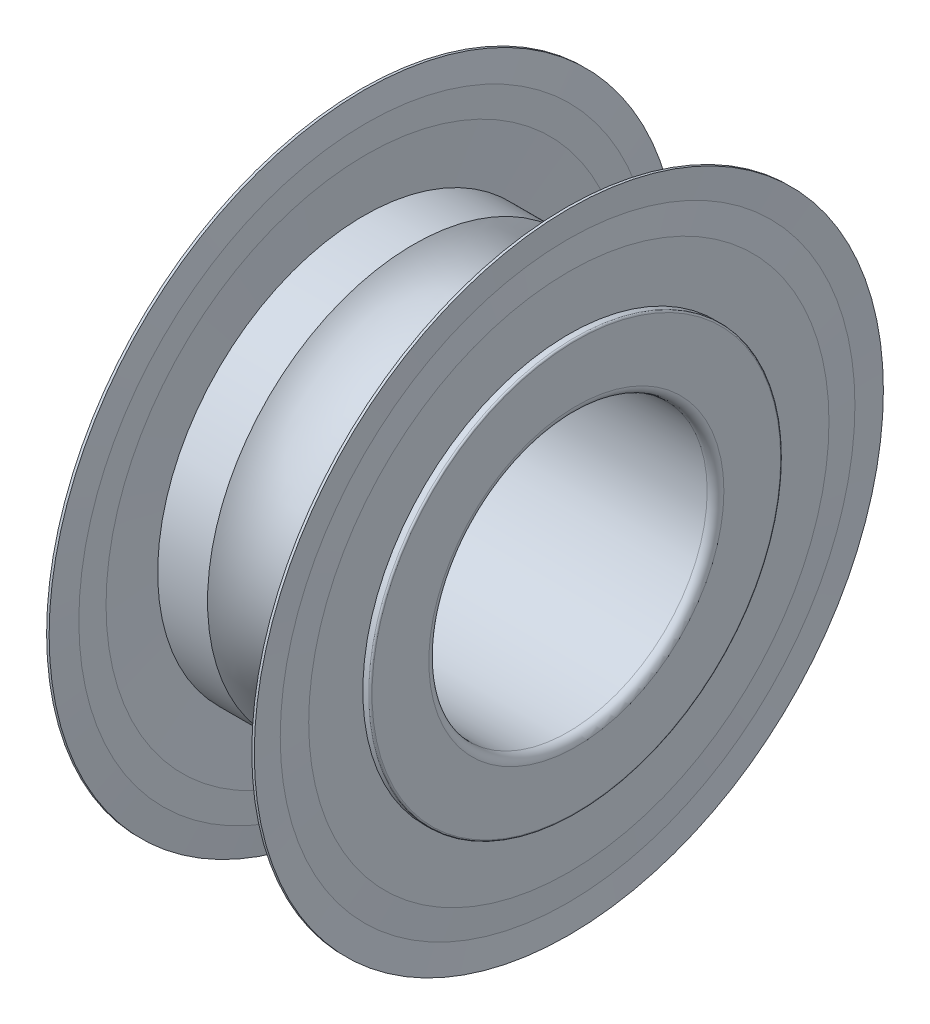
ISO-10303-21;
HEADER;
FILE_DESCRIPTION(('STEP AP214'),'2;1');
FILE_NAME('part.step','',(''),(''),'','','');
FILE_SCHEMA(('AUTOMOTIVE_DESIGN { 1 0 10303 214 1 1 1 1 }'));
ENDSEC;
DATA;
#1=APPLICATION_CONTEXT('core data for automotive mechanical design processes');
#2=APPLICATION_PROTOCOL_DEFINITION('international standard','automotive_design',2000,#1);
#3=PRODUCT_CONTEXT('',#1,'mechanical');
#4=PRODUCT('Part','Part','',(#3));
#5=PRODUCT_RELATED_PRODUCT_CATEGORY('part','',(#4));
#6=PRODUCT_DEFINITION_FORMATION('','',#4);
#7=PRODUCT_DEFINITION_CONTEXT('part definition',#1,'design');
#8=PRODUCT_DEFINITION('design','',#6,#7);
#9=PRODUCT_DEFINITION_SHAPE('','',#8);
#10=(LENGTH_UNIT() NAMED_UNIT(*) SI_UNIT(.MILLI.,.METRE.));
#11=(NAMED_UNIT(*) PLANE_ANGLE_UNIT() SI_UNIT($,.RADIAN.));
#12=(NAMED_UNIT(*) SI_UNIT($,.STERADIAN.) SOLID_ANGLE_UNIT());
#13=UNCERTAINTY_MEASURE_WITH_UNIT(LENGTH_MEASURE(1.E-05),#10,'distance_accuracy_value','');
#14=(GEOMETRIC_REPRESENTATION_CONTEXT(3) GLOBAL_UNCERTAINTY_ASSIGNED_CONTEXT((#13)) GLOBAL_UNIT_ASSIGNED_CONTEXT((#10,
#11,#12)) REPRESENTATION_CONTEXT('',''));
#15=CARTESIAN_POINT('',(0.,0.,0.));
#16=DIRECTION('',(0.,0.,1.));
#17=DIRECTION('',(1.,0.,0.));
#18=AXIS2_PLACEMENT_3D('',#15,#16,#17);
#19=CARTESIAN_POINT('',(50.,0.,0.));
#20=DIRECTION('',(1.,0.,0.));
#21=DIRECTION('',(0.,0.,-1.));
#22=AXIS2_PLACEMENT_3D('',#19,#20,#21);
#23=CYLINDRICAL_SURFACE('',#22,7.4);
#24=CARTESIAN_POINT('',(5.84909734735627,0.,0.));
#25=DIRECTION('',(1.,0.,0.));
#26=DIRECTION('',(0.,0.,-1.));
#27=AXIS2_PLACEMENT_3D('',#24,#25,#26);
#28=CIRCLE('',#27,7.4);
#29=CARTESIAN_POINT('',(5.84909734735627,0.,-7.4));
#30=VERTEX_POINT('',#29);
#31=EDGE_CURVE('E55',#30,#30,#28,.T.);
#32=ORIENTED_EDGE('',*,*,#31,.T.);
#33=EDGE_LOOP('',(#32));
#34=FACE_BOUND('',#33,.T.);
#35=CARTESIAN_POINT('',(7.63953964194374,0.,0.));
#36=DIRECTION('',(-1.,0.,0.));
#37=DIRECTION('',(0.,0.,1.));
#38=AXIS2_PLACEMENT_3D('',#35,#36,#37);
#39=CIRCLE('',#38,7.4);
#40=CARTESIAN_POINT('',(7.63953964194374,0.,7.4));
#41=VERTEX_POINT('',#40);
#42=EDGE_CURVE('E10',#41,#41,#39,.F.);
#43=ORIENTED_EDGE('',*,*,#42,.F.);
#44=EDGE_LOOP('',(#43));
#45=FACE_BOUND('',#44,.T.);
#46=ADVANCED_FACE('F14',(#34,#45),#23,.T.);
#47=CARTESIAN_POINT('',(50.,0.,0.));
#48=DIRECTION('',(1.,0.,0.));
#49=DIRECTION('',(0.,0.,-1.));
#50=AXIS2_PLACEMENT_3D('',#47,#48,#49);
#51=CYLINDRICAL_SURFACE('',#50,7.4);
#52=CARTESIAN_POINT('',(0.0599999999999976,0.,0.));
#53=DIRECTION('',(1.,0.,0.));
#54=DIRECTION('',(0.,0.,-1.));
#55=AXIS2_PLACEMENT_3D('',#52,#53,#54);
#56=CIRCLE('',#55,7.4);
#57=CARTESIAN_POINT('',(0.0599999999999976,0.,-7.4));
#58=VERTEX_POINT('',#57);
#59=EDGE_CURVE('E61',#58,#58,#56,.T.);
#60=ORIENTED_EDGE('',*,*,#59,.T.);
#61=EDGE_LOOP('',(#60));
#62=FACE_BOUND('',#61,.T.);
#63=CARTESIAN_POINT('',(0.27,0.,0.));
#64=DIRECTION('',(-1.,0.,0.));
#65=DIRECTION('',(0.,0.,1.));
#66=AXIS2_PLACEMENT_3D('',#63,#64,#65);
#67=CIRCLE('',#66,7.4);
#68=CARTESIAN_POINT('',(0.27,0.,7.4));
#69=VERTEX_POINT('',#68);
#70=EDGE_CURVE('E25',#69,#69,#67,.F.);
#71=ORIENTED_EDGE('',*,*,#70,.F.);
#72=EDGE_LOOP('',(#71));
#73=FACE_BOUND('',#72,.T.);
#74=ADVANCED_FACE('F122',(#62,#73),#51,.T.);
#75=CARTESIAN_POINT('',(0.0599999999999989,0.,0.));
#76=DIRECTION('',(1.,0.,0.));
#77=DIRECTION('',(0.,0.,-1.));
#78=AXIS2_PLACEMENT_3D('',#75,#76,#77);
#79=TOROIDAL_SURFACE('',#78,7.34,0.0599999999999984);
#80=CARTESIAN_POINT('',(0.,0.,0.));
#81=DIRECTION('',(1.,0.,0.));
#82=DIRECTION('',(0.,0.,-1.));
#83=AXIS2_PLACEMENT_3D('',#80,#81,#82);
#84=CIRCLE('',#83,7.34);
#85=CARTESIAN_POINT('',(0.,0.,-7.34));
#86=VERTEX_POINT('',#85);
#87=EDGE_CURVE('E34',#86,#86,#84,.T.);
#88=ORIENTED_EDGE('',*,*,#87,.T.);
#89=EDGE_LOOP('',(#88));
#90=FACE_BOUND('',#89,.T.);
#91=ORIENTED_EDGE('',*,*,#59,.F.);
#92=EDGE_LOOP('',(#91));
#93=FACE_BOUND('',#92,.T.);
#94=ADVANCED_FACE('F16',(#90,#93),#79,.T.);
#95=CARTESIAN_POINT('',(0.,7.34,0.));
#96=DIRECTION('',(-1.,0.,0.));
#97=DIRECTION('',(0.,0.,1.));
#98=AXIS2_PLACEMENT_3D('',#95,#96,#97);
#99=PLANE('',#98);
#100=CARTESIAN_POINT('',(0.,0.,0.));
#101=DIRECTION('',(1.,0.,0.));
#102=DIRECTION('',(0.,0.,-1.));
#103=AXIS2_PLACEMENT_3D('',#100,#101,#102);
#104=CIRCLE('',#103,5.3);
#105=CARTESIAN_POINT('',(0.,0.,-5.3));
#106=VERTEX_POINT('',#105);
#107=EDGE_CURVE('E37',#106,#106,#104,.T.);
#108=ORIENTED_EDGE('',*,*,#107,.T.);
#109=EDGE_LOOP('',(#108));
#110=FACE_BOUND('',#109,.T.);
#111=ORIENTED_EDGE('',*,*,#87,.F.);
#112=EDGE_LOOP('',(#111));
#113=FACE_BOUND('',#112,.T.);
#114=ADVANCED_FACE('F171',(#110,#113),#99,.T.);
#115=CARTESIAN_POINT('',(0.3,0.,0.));
#116=DIRECTION('',(1.,0.,0.));
#117=DIRECTION('',(0.,0.,-1.));
#118=AXIS2_PLACEMENT_3D('',#115,#116,#117);
#119=TOROIDAL_SURFACE('',#118,5.3,0.3);
#120=CARTESIAN_POINT('',(0.3,0.,0.));
#121=DIRECTION('',(1.,0.,0.));
#122=DIRECTION('',(0.,0.,-1.));
#123=AXIS2_PLACEMENT_3D('',#120,#121,#122);
#124=CIRCLE('',#123,5.);
#125=CARTESIAN_POINT('',(0.3,0.,-5.));
#126=VERTEX_POINT('',#125);
#127=EDGE_CURVE('E40',#126,#126,#124,.T.);
#128=ORIENTED_EDGE('',*,*,#127,.T.);
#129=EDGE_LOOP('',(#128));
#130=FACE_BOUND('',#129,.T.);
#131=ORIENTED_EDGE('',*,*,#107,.F.);
#132=EDGE_LOOP('',(#131));
#133=FACE_BOUND('',#132,.T.);
#134=ADVANCED_FACE('F165',(#130,#133),#119,.T.);
#135=CARTESIAN_POINT('',(50.,0.,0.));
#136=DIRECTION('',(1.,0.,0.));
#137=DIRECTION('',(0.,0.,-1.));
#138=AXIS2_PLACEMENT_3D('',#135,#136,#137);
#139=CYLINDRICAL_SURFACE('',#138,5.);
#140=CARTESIAN_POINT('',(7.7,0.,0.));
#141=DIRECTION('',(1.,0.,0.));
#142=DIRECTION('',(0.,0.,-1.));
#143=AXIS2_PLACEMENT_3D('',#140,#141,#142);
#144=CIRCLE('',#143,5.);
#145=CARTESIAN_POINT('',(7.7,0.,-5.));
#146=VERTEX_POINT('',#145);
#147=EDGE_CURVE('E43',#146,#146,#144,.T.);
#148=ORIENTED_EDGE('',*,*,#147,.T.);
#149=EDGE_LOOP('',(#148));
#150=FACE_BOUND('',#149,.T.);
#151=ORIENTED_EDGE('',*,*,#127,.F.);
#152=EDGE_LOOP('',(#151));
#153=FACE_BOUND('',#152,.T.);
#154=ADVANCED_FACE('F159',(#150,#153),#139,.F.);
#155=CARTESIAN_POINT('',(7.7,0.,0.));
#156=DIRECTION('',(1.,0.,0.));
#157=DIRECTION('',(0.,0.,-1.));
#158=AXIS2_PLACEMENT_3D('',#155,#156,#157);
#159=TOROIDAL_SURFACE('',#158,5.3,0.300000000000003);
#160=CARTESIAN_POINT('',(8.,0.,0.));
#161=DIRECTION('',(1.,0.,0.));
#162=DIRECTION('',(0.,0.,-1.));
#163=AXIS2_PLACEMENT_3D('',#160,#161,#162);
#164=CIRCLE('',#163,5.3);
#165=CARTESIAN_POINT('',(8.,0.,-5.3));
#166=VERTEX_POINT('',#165);
#167=EDGE_CURVE('E46',#166,#166,#164,.T.);
#168=ORIENTED_EDGE('',*,*,#167,.T.);
#169=EDGE_LOOP('',(#168));
#170=FACE_BOUND('',#169,.T.);
#171=ORIENTED_EDGE('',*,*,#147,.F.);
#172=EDGE_LOOP('',(#171));
#173=FACE_BOUND('',#172,.T.);
#174=ADVANCED_FACE('F153',(#170,#173),#159,.T.);
#175=CARTESIAN_POINT('',(8.,5.3,0.));
#176=DIRECTION('',(1.,0.,0.));
#177=DIRECTION('',(0.,0.,-1.));
#178=AXIS2_PLACEMENT_3D('',#175,#176,#177);
#179=PLANE('',#178);
#180=CARTESIAN_POINT('',(8.,0.,0.));
#181=DIRECTION('',(1.,0.,0.));
#182=DIRECTION('',(0.,0.,-1.));
#183=AXIS2_PLACEMENT_3D('',#180,#181,#182);
#184=CIRCLE('',#183,7.34);
#185=CARTESIAN_POINT('',(8.,0.,-7.34));
#186=VERTEX_POINT('',#185);
#187=EDGE_CURVE('E49',#186,#186,#184,.T.);
#188=ORIENTED_EDGE('',*,*,#187,.T.);
#189=EDGE_LOOP('',(#188));
#190=FACE_BOUND('',#189,.T.);
#191=ORIENTED_EDGE('',*,*,#167,.F.);
#192=EDGE_LOOP('',(#191));
#193=FACE_BOUND('',#192,.T.);
#194=ADVANCED_FACE('F144',(#190,#193),#179,.T.);
#195=CARTESIAN_POINT('',(7.94,0.,0.));
#196=DIRECTION('',(1.,0.,0.));
#197=DIRECTION('',(0.,0.,-1.));
#198=AXIS2_PLACEMENT_3D('',#195,#196,#197);
#199=TOROIDAL_SURFACE('',#198,7.34,0.0599999999999993);
#200=CARTESIAN_POINT('',(7.94,0.,0.));
#201=DIRECTION('',(1.,0.,0.));
#202=DIRECTION('',(0.,0.,-1.));
#203=AXIS2_PLACEMENT_3D('',#200,#201,#202);
#204=CIRCLE('',#203,7.4);
#205=CARTESIAN_POINT('',(7.94,0.,-7.4));
#206=VERTEX_POINT('',#205);
#207=EDGE_CURVE('E52',#206,#206,#204,.T.);
#208=ORIENTED_EDGE('',*,*,#207,.T.);
#209=EDGE_LOOP('',(#208));
#210=FACE_BOUND('',#209,.T.);
#211=ORIENTED_EDGE('',*,*,#187,.F.);
#212=EDGE_LOOP('',(#211));
#213=FACE_BOUND('',#212,.T.);
#214=ADVANCED_FACE('F137',(#210,#213),#199,.T.);
#215=CARTESIAN_POINT('',(7.73,0.,0.));
#216=DIRECTION('',(1.,0.,0.));
#217=DIRECTION('',(0.,0.,-1.));
#218=AXIS2_PLACEMENT_3D('',#215,#216,#217);
#219=CIRCLE('',#218,7.4);
#220=CARTESIAN_POINT('',(7.73,0.,-7.4));
#221=VERTEX_POINT('',#220);
#222=EDGE_CURVE('E21',#221,#221,#219,.F.);
#223=ORIENTED_EDGE('',*,*,#222,.F.);
#224=EDGE_LOOP('',(#223));
#225=FACE_BOUND('',#224,.T.);
#226=ORIENTED_EDGE('',*,*,#207,.F.);
#227=EDGE_LOOP('',(#226));
#228=FACE_BOUND('',#227,.T.);
#229=ADVANCED_FACE('F125',(#225,#228),#23,.T.);
#230=CARTESIAN_POINT('',(4.,0.,0.));
#231=DIRECTION('',(1.,0.,0.));
#232=DIRECTION('',(0.,0.,-1.));
#233=AXIS2_PLACEMENT_3D('',#230,#231,#232);
#234=TOROIDAL_SURFACE('',#233,8.9,2.381);
#235=ORIENTED_EDGE('',*,*,#31,.F.);
#236=EDGE_LOOP('',(#235));
#237=FACE_BOUND('',#236,.T.);
#238=CARTESIAN_POINT('',(2.15090265264373,0.,0.));
#239=DIRECTION('',(1.,0.,0.));
#240=DIRECTION('',(0.,0.,-1.));
#241=AXIS2_PLACEMENT_3D('',#238,#239,#240);
#242=CIRCLE('',#241,7.4);
#243=CARTESIAN_POINT('',(2.15090265264373,0.,-7.4));
#244=VERTEX_POINT('',#243);
#245=EDGE_CURVE('E58',#244,#244,#242,.T.);
#246=ORIENTED_EDGE('',*,*,#245,.T.);
#247=EDGE_LOOP('',(#246));
#248=FACE_BOUND('',#247,.T.);
#249=ADVANCED_FACE('F136',(#237,#248),#234,.F.);
#250=CARTESIAN_POINT('',(0.360460358056265,0.,0.));
#251=DIRECTION('',(1.,0.,0.));
#252=DIRECTION('',(0.,0.,-1.));
#253=AXIS2_PLACEMENT_3D('',#250,#251,#252);
#254=CIRCLE('',#253,7.4);
#255=CARTESIAN_POINT('',(0.360460358056265,0.,-7.4));
#256=VERTEX_POINT('',#255);
#257=EDGE_CURVE('E29',#256,#256,#254,.F.);
#258=ORIENTED_EDGE('',*,*,#257,.F.);
#259=EDGE_LOOP('',(#258));
#260=FACE_BOUND('',#259,.T.);
#261=ORIENTED_EDGE('',*,*,#245,.F.);
#262=EDGE_LOOP('',(#261));
#263=FACE_BOUND('',#262,.T.);
#264=ADVANCED_FACE('F131',(#260,#263),#51,.T.);
#265=CARTESIAN_POINT('',(50.,0.,0.));
#266=DIRECTION('',(1.,0.,0.));
#267=DIRECTION('',(0.,0.,-1.));
#268=AXIS2_PLACEMENT_3D('',#265,#266,#267);
#269=CYLINDRICAL_SURFACE('',#268,11.3);
#270=CARTESIAN_POINT('',(0.27,0.,0.));
#271=DIRECTION('',(1.,0.,0.));
#272=DIRECTION('',(0.,0.,-1.));
#273=AXIS2_PLACEMENT_3D('',#270,#271,#272);
#274=CIRCLE('',#273,11.3);
#275=CARTESIAN_POINT('',(0.27,0.,-11.3));
#276=VERTEX_POINT('',#275);
#277=EDGE_CURVE('E64',#276,#276,#274,.T.);
#278=ORIENTED_EDGE('',*,*,#277,.T.);
#279=EDGE_LOOP('',(#278));
#280=FACE_BOUND('',#279,.T.);
#281=CARTESIAN_POINT('',(0.36,0.,0.));
#282=DIRECTION('',(1.,0.,0.));
#283=DIRECTION('',(0.,0.,-1.));
#284=AXIS2_PLACEMENT_3D('',#281,#282,#283);
#285=CIRCLE('',#284,11.3);
#286=CARTESIAN_POINT('',(0.36,0.,-11.3));
#287=VERTEX_POINT('',#286);
#288=EDGE_CURVE('E79',#287,#287,#285,.T.);
#289=ORIENTED_EDGE('',*,*,#288,.F.);
#290=EDGE_LOOP('',(#289));
#291=FACE_BOUND('',#290,.T.);
#292=ADVANCED_FACE('F201',(#280,#291),#269,.T.);
#293=CARTESIAN_POINT('',(0.27,0.,0.));
#294=DIRECTION('',(-1.,0.,0.));
#295=DIRECTION('',(0.,0.,1.));
#296=AXIS2_PLACEMENT_3D('',#293,#294,#295);
#297=CONICAL_SURFACE('',#296,11.3,1.52479300103466);
#298=CARTESIAN_POINT('',(0.315,0.,0.));
#299=DIRECTION('',(1.,0.,0.));
#300=DIRECTION('',(0.,0.,-1.));
#301=AXIS2_PLACEMENT_3D('',#298,#299,#300);
#302=CIRCLE('',#301,10.3225);
#303=CARTESIAN_POINT('',(0.315,0.,-10.3225));
#304=VERTEX_POINT('',#303);
#305=EDGE_CURVE('E67',#304,#304,#302,.T.);
#306=ORIENTED_EDGE('',*,*,#305,.T.);
#307=EDGE_LOOP('',(#306));
#308=FACE_BOUND('',#307,.T.);
#309=ORIENTED_EDGE('',*,*,#277,.F.);
#310=EDGE_LOOP('',(#309));
#311=FACE_BOUND('',#310,.T.);
#312=ADVANCED_FACE('F195',(#308,#311),#297,.F.);
#313=CARTESIAN_POINT('',(0.315,0.,0.));
#314=DIRECTION('',(1.,0.,0.));
#315=DIRECTION('',(0.,0.,-1.));
#316=AXIS2_PLACEMENT_3D('',#313,#314,#315);
#317=CONICAL_SURFACE('',#316,10.3225,1.52479300103466);
#318=CARTESIAN_POINT('',(0.27,0.,0.));
#319=DIRECTION('',(1.,0.,0.));
#320=DIRECTION('',(0.,0.,-1.));
#321=AXIS2_PLACEMENT_3D('',#318,#319,#320);
#322=CIRCLE('',#321,9.345);
#323=CARTESIAN_POINT('',(0.27,0.,-9.345));
#324=VERTEX_POINT('',#323);
#325=EDGE_CURVE('E70',#324,#324,#322,.T.);
#326=ORIENTED_EDGE('',*,*,#325,.T.);
#327=EDGE_LOOP('',(#326));
#328=FACE_BOUND('',#327,.T.);
#329=ORIENTED_EDGE('',*,*,#305,.F.);
#330=EDGE_LOOP('',(#329));
#331=FACE_BOUND('',#330,.T.);
#332=ADVANCED_FACE('F189',(#328,#331),#317,.T.);
#333=CARTESIAN_POINT('',(0.27,9.345,0.));
#334=DIRECTION('',(-1.,0.,0.));
#335=DIRECTION('',(0.,0.,1.));
#336=AXIS2_PLACEMENT_3D('',#333,#334,#335);
#337=PLANE('',#336);
#338=ORIENTED_EDGE('',*,*,#70,.T.);
#339=EDGE_LOOP('',(#338));
#340=FACE_BOUND('',#339,.T.);
#341=ORIENTED_EDGE('',*,*,#325,.F.);
#342=EDGE_LOOP('',(#341));
#343=FACE_BOUND('',#342,.T.);
#344=ADVANCED_FACE('F185',(#340,#343),#337,.T.);
#345=CARTESIAN_POINT('',(0.36,0.,0.));
#346=DIRECTION('',(1.,0.,0.));
#347=DIRECTION('',(0.,0.,-1.));
#348=AXIS2_PLACEMENT_3D('',#345,#346,#347);
#349=CONICAL_SURFACE('',#348,7.39,1.52479300103466);
#350=CARTESIAN_POINT('',(0.45,0.,0.));
#351=DIRECTION('',(1.,0.,0.));
#352=DIRECTION('',(0.,0.,-1.));
#353=AXIS2_PLACEMENT_3D('',#350,#351,#352);
#354=CIRCLE('',#353,9.345);
#355=CARTESIAN_POINT('',(0.45,0.,-9.345));
#356=VERTEX_POINT('',#355);
#357=EDGE_CURVE('E73',#356,#356,#354,.T.);
#358=ORIENTED_EDGE('',*,*,#357,.T.);
#359=EDGE_LOOP('',(#358));
#360=FACE_BOUND('',#359,.T.);
#361=ORIENTED_EDGE('',*,*,#257,.T.);
#362=EDGE_LOOP('',(#361));
#363=FACE_BOUND('',#362,.T.);
#364=ADVANCED_FACE('F188',(#360,#363),#349,.F.);
#365=CARTESIAN_POINT('',(0.45,9.345,0.));
#366=DIRECTION('',(1.,0.,0.));
#367=DIRECTION('',(0.,0.,-1.));
#368=AXIS2_PLACEMENT_3D('',#365,#366,#367);
#369=PLANE('',#368);
#370=CARTESIAN_POINT('',(0.45,0.,0.));
#371=DIRECTION('',(1.,0.,0.));
#372=DIRECTION('',(0.,0.,-1.));
#373=AXIS2_PLACEMENT_3D('',#370,#371,#372);
#374=CIRCLE('',#373,10.3225);
#375=CARTESIAN_POINT('',(0.45,0.,-10.3225));
#376=VERTEX_POINT('',#375);
#377=EDGE_CURVE('E76',#376,#376,#374,.T.);
#378=ORIENTED_EDGE('',*,*,#377,.T.);
#379=EDGE_LOOP('',(#378));
#380=FACE_BOUND('',#379,.T.);
#381=ORIENTED_EDGE('',*,*,#357,.F.);
#382=EDGE_LOOP('',(#381));
#383=FACE_BOUND('',#382,.T.);
#384=ADVANCED_FACE('F118',(#380,#383),#369,.T.);
#385=CARTESIAN_POINT('',(0.45,0.,0.));
#386=DIRECTION('',(-1.,0.,0.));
#387=DIRECTION('',(0.,0.,1.));
#388=AXIS2_PLACEMENT_3D('',#385,#386,#387);
#389=CONICAL_SURFACE('',#388,10.3225,1.478983569457);
#390=ORIENTED_EDGE('',*,*,#288,.T.);
#391=EDGE_LOOP('',(#390));
#392=FACE_BOUND('',#391,.T.);
#393=ORIENTED_EDGE('',*,*,#377,.F.);
#394=EDGE_LOOP('',(#393));
#395=FACE_BOUND('',#394,.T.);
#396=ADVANCED_FACE('F107',(#392,#395),#389,.T.);
#397=CARTESIAN_POINT('',(7.64,0.,0.));
#398=DIRECTION('',(1.,0.,0.));
#399=DIRECTION('',(0.,0.,-1.));
#400=AXIS2_PLACEMENT_3D('',#397,#398,#399);
#401=CONICAL_SURFACE('',#400,11.3,1.478983569457);
#402=CARTESIAN_POINT('',(7.55,0.,0.));
#403=DIRECTION('',(1.,0.,0.));
#404=DIRECTION('',(0.,0.,-1.));
#405=AXIS2_PLACEMENT_3D('',#402,#403,#404);
#406=CIRCLE('',#405,10.3225);
#407=CARTESIAN_POINT('',(7.55,0.,-10.3225));
#408=VERTEX_POINT('',#407);
#409=EDGE_CURVE('E82',#408,#408,#406,.T.);
#410=ORIENTED_EDGE('',*,*,#409,.T.);
#411=EDGE_LOOP('',(#410));
#412=FACE_BOUND('',#411,.T.);
#413=CARTESIAN_POINT('',(7.64,0.,0.));
#414=DIRECTION('',(1.,0.,0.));
#415=DIRECTION('',(0.,0.,-1.));
#416=AXIS2_PLACEMENT_3D('',#413,#414,#415);
#417=CIRCLE('',#416,11.3);
#418=CARTESIAN_POINT('',(7.64,0.,-11.3));
#419=VERTEX_POINT('',#418);
#420=EDGE_CURVE('E97',#419,#419,#417,.T.);
#421=ORIENTED_EDGE('',*,*,#420,.F.);
#422=EDGE_LOOP('',(#421));
#423=FACE_BOUND('',#422,.T.);
#424=ADVANCED_FACE('F104',(#412,#423),#401,.T.);
#425=CARTESIAN_POINT('',(7.55,10.3225,0.));
#426=DIRECTION('',(-1.,0.,0.));
#427=DIRECTION('',(0.,0.,1.));
#428=AXIS2_PLACEMENT_3D('',#425,#426,#427);
#429=PLANE('',#428);
#430=CARTESIAN_POINT('',(7.55,0.,0.));
#431=DIRECTION('',(1.,0.,0.));
#432=DIRECTION('',(0.,0.,-1.));
#433=AXIS2_PLACEMENT_3D('',#430,#431,#432);
#434=CIRCLE('',#433,9.345);
#435=CARTESIAN_POINT('',(7.55,0.,-9.345));
#436=VERTEX_POINT('',#435);
#437=EDGE_CURVE('E85',#436,#436,#434,.T.);
#438=ORIENTED_EDGE('',*,*,#437,.T.);
#439=EDGE_LOOP('',(#438));
#440=FACE_BOUND('',#439,.T.);
#441=ORIENTED_EDGE('',*,*,#409,.F.);
#442=EDGE_LOOP('',(#441));
#443=FACE_BOUND('',#442,.T.);
#444=ADVANCED_FACE('F106',(#440,#443),#429,.T.);
#445=CARTESIAN_POINT('',(7.55,0.,0.));
#446=DIRECTION('',(-1.,0.,0.));
#447=DIRECTION('',(0.,0.,1.));
#448=AXIS2_PLACEMENT_3D('',#445,#446,#447);
#449=CONICAL_SURFACE('',#448,9.345,1.52479300103466);
#450=ORIENTED_EDGE('',*,*,#42,.T.);
#451=EDGE_LOOP('',(#450));
#452=FACE_BOUND('',#451,.T.);
#453=ORIENTED_EDGE('',*,*,#437,.F.);
#454=EDGE_LOOP('',(#453));
#455=FACE_BOUND('',#454,.T.);
#456=ADVANCED_FACE('F115',(#452,#455),#449,.F.);
#457=CARTESIAN_POINT('',(7.73,7.39,0.));
#458=DIRECTION('',(1.,0.,0.));
#459=DIRECTION('',(0.,0.,-1.));
#460=AXIS2_PLACEMENT_3D('',#457,#458,#459);
#461=PLANE('',#460);
#462=CARTESIAN_POINT('',(7.73,0.,0.));
#463=DIRECTION('',(1.,0.,0.));
#464=DIRECTION('',(0.,0.,-1.));
#465=AXIS2_PLACEMENT_3D('',#462,#463,#464);
#466=CIRCLE('',#465,9.345);
#467=CARTESIAN_POINT('',(7.73,0.,-9.345));
#468=VERTEX_POINT('',#467);
#469=EDGE_CURVE('E88',#468,#468,#466,.T.);
#470=ORIENTED_EDGE('',*,*,#469,.T.);
#471=EDGE_LOOP('',(#470));
#472=FACE_BOUND('',#471,.T.);
#473=ORIENTED_EDGE('',*,*,#222,.T.);
#474=EDGE_LOOP('',(#473));
#475=FACE_BOUND('',#474,.T.);
#476=ADVANCED_FACE('F282',(#472,#475),#461,.T.);
#477=CARTESIAN_POINT('',(7.73,0.,0.));
#478=DIRECTION('',(-1.,0.,0.));
#479=DIRECTION('',(0.,0.,1.));
#480=AXIS2_PLACEMENT_3D('',#477,#478,#479);
#481=CONICAL_SURFACE('',#480,9.345,1.52479300103466);
#482=CARTESIAN_POINT('',(7.685,0.,0.));
#483=DIRECTION('',(1.,0.,0.));
#484=DIRECTION('',(0.,0.,-1.));
#485=AXIS2_PLACEMENT_3D('',#482,#483,#484);
#486=CIRCLE('',#485,10.3225);
#487=CARTESIAN_POINT('',(7.685,0.,-10.3225));
#488=VERTEX_POINT('',#487);
#489=EDGE_CURVE('E91',#488,#488,#486,.T.);
#490=ORIENTED_EDGE('',*,*,#489,.T.);
#491=EDGE_LOOP('',(#490));
#492=FACE_BOUND('',#491,.T.);
#493=ORIENTED_EDGE('',*,*,#469,.F.);
#494=EDGE_LOOP('',(#493));
#495=FACE_BOUND('',#494,.T.);
#496=ADVANCED_FACE('F291',(#492,#495),#481,.T.);
#497=CARTESIAN_POINT('',(7.685,0.,0.));
#498=DIRECTION('',(1.,0.,0.));
#499=DIRECTION('',(0.,0.,-1.));
#500=AXIS2_PLACEMENT_3D('',#497,#498,#499);
#501=CONICAL_SURFACE('',#500,10.3225,1.52479300103466);
#502=CARTESIAN_POINT('',(7.73,0.,0.));
#503=DIRECTION('',(1.,0.,0.));
#504=DIRECTION('',(0.,0.,-1.));
#505=AXIS2_PLACEMENT_3D('',#502,#503,#504);
#506=CIRCLE('',#505,11.3);
#507=CARTESIAN_POINT('',(7.73,0.,-11.3));
#508=VERTEX_POINT('',#507);
#509=EDGE_CURVE('E94',#508,#508,#506,.T.);
#510=ORIENTED_EDGE('',*,*,#509,.T.);
#511=EDGE_LOOP('',(#510));
#512=FACE_BOUND('',#511,.T.);
#513=ORIENTED_EDGE('',*,*,#489,.F.);
#514=EDGE_LOOP('',(#513));
#515=FACE_BOUND('',#514,.T.);
#516=ADVANCED_FACE('F301',(#512,#515),#501,.F.);
#517=CARTESIAN_POINT('',(50.,0.,0.));
#518=DIRECTION('',(1.,0.,0.));
#519=DIRECTION('',(0.,0.,-1.));
#520=AXIS2_PLACEMENT_3D('',#517,#518,#519);
#521=CYLINDRICAL_SURFACE('',#520,11.3);
#522=ORIENTED_EDGE('',*,*,#420,.T.);
#523=EDGE_LOOP('',(#522));
#524=FACE_BOUND('',#523,.T.);
#525=ORIENTED_EDGE('',*,*,#509,.F.);
#526=EDGE_LOOP('',(#525));
#527=FACE_BOUND('',#526,.T.);
#528=ADVANCED_FACE('F101',(#524,#527),#521,.T.);
#529=CLOSED_SHELL('',(#46,#74,#94,#114,#134,#154,#174,#194,#214,#229,#249,#264,#292,#312,#332,
#344,#364,#384,#396,#424,#444,#456,#476,#496,#516,#528));
#530=MANIFOLD_SOLID_BREP('B1',#529);
#531=ADVANCED_BREP_SHAPE_REPRESENTATION('',(#18,#530),#14);
#532=SHAPE_DEFINITION_REPRESENTATION(#9,#531);
ENDSEC;
END-ISO-10303-21;
